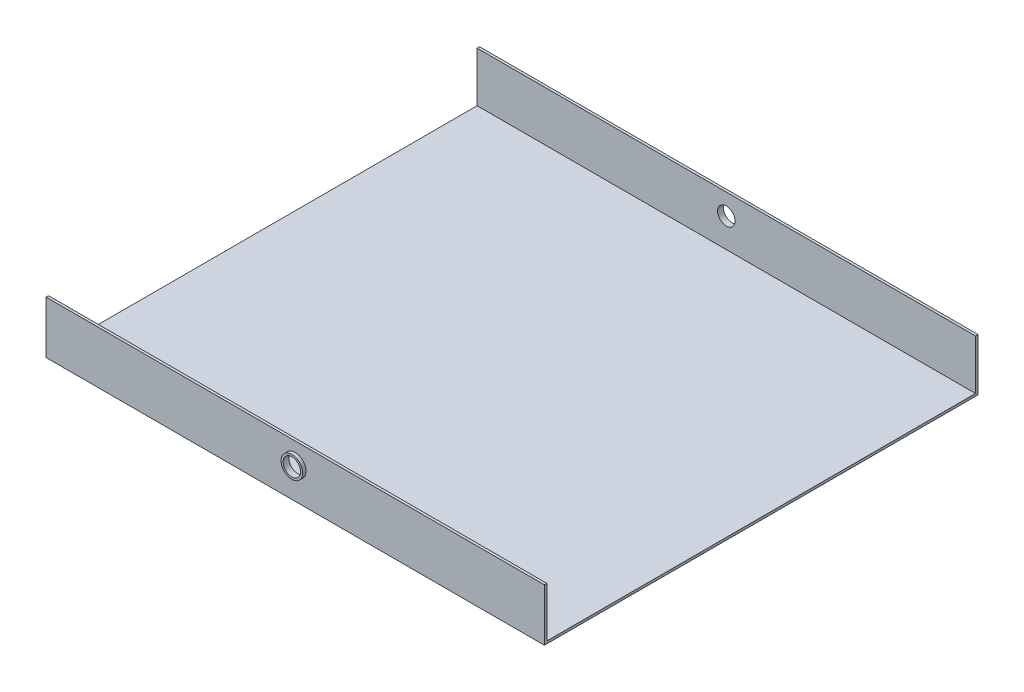
ISO-10303-21;
HEADER;
FILE_DESCRIPTION(('STEP AP214'),'2;1');
FILE_NAME('part.step','',(''),(''),'','','');
FILE_SCHEMA(('AUTOMOTIVE_DESIGN { 1 0 10303 214 1 1 1 1 }'));
ENDSEC;
DATA;
#1=APPLICATION_CONTEXT('core data for automotive mechanical design processes');
#2=APPLICATION_PROTOCOL_DEFINITION('international standard','automotive_design',2000,#1);
#3=PRODUCT_CONTEXT('',#1,'mechanical');
#4=PRODUCT('Part','Part','',(#3));
#5=PRODUCT_RELATED_PRODUCT_CATEGORY('part','',(#4));
#6=PRODUCT_DEFINITION_FORMATION('','',#4);
#7=PRODUCT_DEFINITION_CONTEXT('part definition',#1,'design');
#8=PRODUCT_DEFINITION('design','',#6,#7);
#9=PRODUCT_DEFINITION_SHAPE('','',#8);
#10=(LENGTH_UNIT() NAMED_UNIT(*) SI_UNIT(.MILLI.,.METRE.));
#11=(NAMED_UNIT(*) PLANE_ANGLE_UNIT() SI_UNIT($,.RADIAN.));
#12=(NAMED_UNIT(*) SI_UNIT($,.STERADIAN.) SOLID_ANGLE_UNIT());
#13=UNCERTAINTY_MEASURE_WITH_UNIT(LENGTH_MEASURE(1.E-05),#10,'distance_accuracy_value','');
#14=(GEOMETRIC_REPRESENTATION_CONTEXT(3) GLOBAL_UNCERTAINTY_ASSIGNED_CONTEXT((#13)) GLOBAL_UNIT_ASSIGNED_CONTEXT((#10,
#11,#12)) REPRESENTATION_CONTEXT('',''));
#15=CARTESIAN_POINT('',(0.,0.,0.));
#16=DIRECTION('',(0.,0.,1.));
#17=DIRECTION('',(1.,0.,0.));
#18=AXIS2_PLACEMENT_3D('',#15,#16,#17);
#19=CARTESIAN_POINT('',(1200.,12.6983317095866,-1044.));
#20=DIRECTION('',(0.,0.,1.));
#21=DIRECTION('',(1.,0.,0.));
#22=AXIS2_PLACEMENT_3D('',#19,#20,#21);
#23=PLANE('',#22);
#24=DIRECTION('',(0.,1.,0.));
#25=VECTOR('',#24,1.);
#26=CARTESIAN_POINT('',(-1200.,12.6983317095866,-1044.));
#27=LINE('',#26,#25);
#28=CARTESIAN_POINT('',(-1200.,0.698331709586608,-1044.));
#29=VERTEX_POINT('',#28);
#30=CARTESIAN_POINT('',(-1200.,252.698331709587,-1044.));
#31=VERTEX_POINT('',#30);
#32=EDGE_CURVE('E126',#29,#31,#27,.T.);
#33=ORIENTED_EDGE('',*,*,#32,.T.);
#34=DIRECTION('',(-1.,0.,0.));
#35=VECTOR('',#34,1.);
#36=CARTESIAN_POINT('',(1200.,252.698331709587,-1044.));
#37=LINE('',#36,#35);
#38=CARTESIAN_POINT('',(1200.,252.698331709587,-1044.));
#39=VERTEX_POINT('',#38);
#40=EDGE_CURVE('E50',#39,#31,#37,.T.);
#41=ORIENTED_EDGE('',*,*,#40,.F.);
#42=DIRECTION('',(0.,1.,0.));
#43=VECTOR('',#42,1.);
#44=CARTESIAN_POINT('',(1200.,12.6983317095866,-1044.));
#45=LINE('',#44,#43);
#46=CARTESIAN_POINT('',(1200.,0.698331709586608,-1044.));
#47=VERTEX_POINT('',#46);
#48=EDGE_CURVE('E89',#47,#39,#45,.T.);
#49=ORIENTED_EDGE('',*,*,#48,.F.);
#50=DIRECTION('',(-1.,0.,0.));
#51=VECTOR('',#50,1.);
#52=CARTESIAN_POINT('',(1200.,0.698331709586608,-1044.));
#53=LINE('',#52,#51);
#54=EDGE_CURVE('E116',#47,#29,#53,.T.);
#55=ORIENTED_EDGE('',*,*,#54,.T.);
#56=EDGE_LOOP('',(#33,#41,#49,#55));
#57=FACE_BOUND('',#56,.T.);
#58=CARTESIAN_POINT('',(-3.49077471759439E-13,152.698331709587,-1044.));
#59=DIRECTION('',(0.,0.,1.));
#60=DIRECTION('',(1.,0.,0.));
#61=AXIS2_PLACEMENT_3D('',#58,#59,#60);
#62=CIRCLE('',#61,52.0000000000002);
#63=CARTESIAN_POINT('',(51.9999999999998,152.698331709587,-1044.));
#64=VERTEX_POINT('',#63);
#65=EDGE_CURVE('E11',#64,#64,#62,.F.);
#66=ORIENTED_EDGE('',*,*,#65,.F.);
#67=EDGE_LOOP('',(#66));
#68=FACE_BOUND('',#67,.T.);
#69=ADVANCED_FACE('F42',(#57,#68),#23,.F.);
#70=CARTESIAN_POINT('',(1200.,12.6983317095866,1044.));
#71=DIRECTION('',(0.,0.,1.));
#72=DIRECTION('',(1.,0.,0.));
#73=AXIS2_PLACEMENT_3D('',#70,#71,#72);
#74=PLANE('',#73);
#75=DIRECTION('',(0.,1.,0.));
#76=VECTOR('',#75,1.);
#77=CARTESIAN_POINT('',(-1200.,12.6983317095866,1044.));
#78=LINE('',#77,#76);
#79=CARTESIAN_POINT('',(-1200.,0.698331709586608,1044.));
#80=VERTEX_POINT('',#79);
#81=CARTESIAN_POINT('',(-1200.,252.698331709587,1044.));
#82=VERTEX_POINT('',#81);
#83=EDGE_CURVE('E125',#80,#82,#78,.T.);
#84=ORIENTED_EDGE('',*,*,#83,.F.);
#85=DIRECTION('',(-1.,0.,0.));
#86=VECTOR('',#85,1.);
#87=CARTESIAN_POINT('',(1200.,0.698331709586608,1044.));
#88=LINE('',#87,#86);
#89=CARTESIAN_POINT('',(1200.,0.698331709586608,1044.));
#90=VERTEX_POINT('',#89);
#91=EDGE_CURVE('E114',#90,#80,#88,.T.);
#92=ORIENTED_EDGE('',*,*,#91,.F.);
#93=DIRECTION('',(0.,1.,0.));
#94=VECTOR('',#93,1.);
#95=CARTESIAN_POINT('',(1200.,12.6983317095866,1044.));
#96=LINE('',#95,#94);
#97=CARTESIAN_POINT('',(1200.,252.698331709587,1044.));
#98=VERTEX_POINT('',#97);
#99=EDGE_CURVE('E123',#90,#98,#96,.T.);
#100=ORIENTED_EDGE('',*,*,#99,.T.);
#101=DIRECTION('',(-1.,0.,0.));
#102=VECTOR('',#101,1.);
#103=CARTESIAN_POINT('',(1200.,252.698331709587,1044.));
#104=LINE('',#103,#102);
#105=EDGE_CURVE('E145',#98,#82,#104,.T.);
#106=ORIENTED_EDGE('',*,*,#105,.T.);
#107=EDGE_LOOP('',(#84,#92,#100,#106));
#108=FACE_BOUND('',#107,.T.);
#109=CARTESIAN_POINT('',(-3.49077471759439E-13,152.698331709587,1044.));
#110=DIRECTION('',(0.,0.,1.));
#111=DIRECTION('',(1.,0.,0.));
#112=AXIS2_PLACEMENT_3D('',#109,#110,#111);
#113=CIRCLE('',#112,52.0000000000001);
#114=CARTESIAN_POINT('',(51.9999999999998,152.698331709587,1044.));
#115=VERTEX_POINT('',#114);
#116=EDGE_CURVE('E184',#115,#115,#113,.T.);
#117=ORIENTED_EDGE('',*,*,#116,.F.);
#118=EDGE_LOOP('',(#117));
#119=FACE_BOUND('',#118,.T.);
#120=ADVANCED_FACE('F121',(#108,#119),#74,.T.);
#121=CARTESIAN_POINT('',(1200.,252.698331709587,-1032.));
#122=DIRECTION('',(0.,1.,0.));
#123=DIRECTION('',(0.,0.,1.));
#124=AXIS2_PLACEMENT_3D('',#121,#122,#123);
#125=PLANE('',#124);
#126=DIRECTION('',(0.,0.,-1.));
#127=VECTOR('',#126,1.);
#128=CARTESIAN_POINT('',(-1200.,252.698331709587,-1032.));
#129=LINE('',#128,#127);
#130=CARTESIAN_POINT('',(-1200.,252.698331709587,-1032.));
#131=VERTEX_POINT('',#130);
#132=EDGE_CURVE('E165',#131,#31,#129,.T.);
#133=ORIENTED_EDGE('',*,*,#132,.F.);
#134=DIRECTION('',(-1.,0.,0.));
#135=VECTOR('',#134,1.);
#136=CARTESIAN_POINT('',(1200.,252.698331709587,-1032.));
#137=LINE('',#136,#135);
#138=CARTESIAN_POINT('',(1200.,252.698331709587,-1032.));
#139=VERTEX_POINT('',#138);
#140=EDGE_CURVE('E175',#139,#131,#137,.T.);
#141=ORIENTED_EDGE('',*,*,#140,.F.);
#142=DIRECTION('',(0.,0.,-1.));
#143=VECTOR('',#142,1.);
#144=CARTESIAN_POINT('',(1200.,252.698331709587,-1032.));
#145=LINE('',#144,#143);
#146=EDGE_CURVE('E155',#139,#39,#145,.T.);
#147=ORIENTED_EDGE('',*,*,#146,.T.);
#148=ORIENTED_EDGE('',*,*,#40,.T.);
#149=EDGE_LOOP('',(#133,#141,#147,#148));
#150=FACE_BOUND('',#149,.T.);
#151=ADVANCED_FACE('F222',(#150),#125,.T.);
#152=CARTESIAN_POINT('',(1200.,12.6983317095866,-1032.));
#153=DIRECTION('',(0.,0.,1.));
#154=DIRECTION('',(1.,0.,0.));
#155=AXIS2_PLACEMENT_3D('',#152,#153,#154);
#156=PLANE('',#155);
#157=CARTESIAN_POINT('',(-3.49077471759439E-13,152.698331709587,-1032.));
#158=DIRECTION('',(0.,0.,1.));
#159=DIRECTION('',(1.,0.,0.));
#160=AXIS2_PLACEMENT_3D('',#157,#158,#159);
#161=CIRCLE('',#160,42.);
#162=CARTESIAN_POINT('',(41.9999999999997,152.698331709587,-1032.));
#163=VERTEX_POINT('',#162);
#164=EDGE_CURVE('E141',#163,#163,#161,.T.);
#165=ORIENTED_EDGE('',*,*,#164,.F.);
#166=EDGE_LOOP('',(#165));
#167=FACE_BOUND('',#166,.T.);
#168=DIRECTION('',(0.,1.,0.));
#169=VECTOR('',#168,1.);
#170=CARTESIAN_POINT('',(-1200.,12.6983317095866,-1032.));
#171=LINE('',#170,#169);
#172=CARTESIAN_POINT('',(-1200.,12.6983317095866,-1032.));
#173=VERTEX_POINT('',#172);
#174=EDGE_CURVE('E168',#173,#131,#171,.T.);
#175=ORIENTED_EDGE('',*,*,#174,.F.);
#176=DIRECTION('',(-1.,0.,0.));
#177=VECTOR('',#176,1.);
#178=CARTESIAN_POINT('',(1200.,12.6983317095866,-1032.));
#179=LINE('',#178,#177);
#180=CARTESIAN_POINT('',(1200.,12.6983317095866,-1032.));
#181=VERTEX_POINT('',#180);
#182=EDGE_CURVE('E173',#181,#173,#179,.T.);
#183=ORIENTED_EDGE('',*,*,#182,.F.);
#184=DIRECTION('',(0.,1.,0.));
#185=VECTOR('',#184,1.);
#186=CARTESIAN_POINT('',(1200.,12.6983317095866,-1032.));
#187=LINE('',#186,#185);
#188=EDGE_CURVE('E158',#181,#139,#187,.T.);
#189=ORIENTED_EDGE('',*,*,#188,.T.);
#190=ORIENTED_EDGE('',*,*,#140,.T.);
#191=EDGE_LOOP('',(#175,#183,#189,#190));
#192=FACE_BOUND('',#191,.T.);
#193=ADVANCED_FACE('F234',(#167,#192),#156,.T.);
#194=CARTESIAN_POINT('',(1200.,12.6983317095866,-800.000000000001));
#195=DIRECTION('',(0.,1.,0.));
#196=DIRECTION('',(0.,0.,1.));
#197=AXIS2_PLACEMENT_3D('',#194,#195,#196);
#198=PLANE('',#197);
#199=DIRECTION('',(0.,0.,-1.));
#200=VECTOR('',#199,1.);
#201=CARTESIAN_POINT('',(-1200.,12.6983317095866,-800.000000000001));
#202=LINE('',#201,#200);
#203=CARTESIAN_POINT('',(-1200.,12.6983317095866,1032.));
#204=VERTEX_POINT('',#203);
#205=EDGE_CURVE('E77',#204,#173,#202,.T.);
#206=ORIENTED_EDGE('',*,*,#205,.F.);
#207=DIRECTION('',(-1.,0.,0.));
#208=VECTOR('',#207,1.);
#209=CARTESIAN_POINT('',(1200.,12.6983317095866,1032.));
#210=LINE('',#209,#208);
#211=CARTESIAN_POINT('',(1200.,12.6983317095866,1032.));
#212=VERTEX_POINT('',#211);
#213=EDGE_CURVE('E127',#212,#204,#210,.T.);
#214=ORIENTED_EDGE('',*,*,#213,.F.);
#215=DIRECTION('',(0.,0.,-1.));
#216=VECTOR('',#215,1.);
#217=CARTESIAN_POINT('',(1200.,12.6983317095866,-800.000000000001));
#218=LINE('',#217,#216);
#219=EDGE_CURVE('E117',#212,#181,#218,.T.);
#220=ORIENTED_EDGE('',*,*,#219,.T.);
#221=ORIENTED_EDGE('',*,*,#182,.T.);
#222=EDGE_LOOP('',(#206,#214,#220,#221));
#223=FACE_BOUND('',#222,.T.);
#224=ADVANCED_FACE('F236',(#223),#198,.T.);
#225=CARTESIAN_POINT('',(1200.,0.698331709586608,-800.000000000001));
#226=DIRECTION('',(0.,1.,0.));
#227=DIRECTION('',(0.,0.,1.));
#228=AXIS2_PLACEMENT_3D('',#225,#226,#227);
#229=PLANE('',#228);
#230=DIRECTION('',(0.,0.,-1.));
#231=VECTOR('',#230,1.);
#232=CARTESIAN_POINT('',(-1200.,0.698331709586608,-800.000000000001));
#233=LINE('',#232,#231);
#234=EDGE_CURVE('E84',#80,#29,#233,.T.);
#235=ORIENTED_EDGE('',*,*,#234,.T.);
#236=ORIENTED_EDGE('',*,*,#54,.F.);
#237=DIRECTION('',(0.,0.,-1.));
#238=VECTOR('',#237,1.);
#239=CARTESIAN_POINT('',(1200.,0.698331709586608,-800.000000000001));
#240=LINE('',#239,#238);
#241=EDGE_CURVE('E58',#90,#47,#240,.T.);
#242=ORIENTED_EDGE('',*,*,#241,.F.);
#243=ORIENTED_EDGE('',*,*,#91,.T.);
#244=EDGE_LOOP('',(#235,#236,#242,#243));
#245=FACE_BOUND('',#244,.T.);
#246=ADVANCED_FACE('F113',(#245),#229,.F.);
#247=CARTESIAN_POINT('',(1200.,-211.301668290413,-1.06007604958585E-12));
#248=DIRECTION('',(-1.,0.,0.));
#249=DIRECTION('',(0.,0.,1.));
#250=AXIS2_PLACEMENT_3D('',#247,#248,#249);
#251=PLANE('',#250);
#252=ORIENTED_EDGE('',*,*,#48,.T.);
#253=ORIENTED_EDGE('',*,*,#146,.F.);
#254=ORIENTED_EDGE('',*,*,#188,.F.);
#255=ORIENTED_EDGE('',*,*,#219,.F.);
#256=DIRECTION('',(0.,1.,0.));
#257=VECTOR('',#256,1.);
#258=CARTESIAN_POINT('',(1200.,12.6983317095866,1032.));
#259=LINE('',#258,#257);
#260=CARTESIAN_POINT('',(1200.,252.698331709587,1032.));
#261=VERTEX_POINT('',#260);
#262=EDGE_CURVE('E133',#212,#261,#259,.T.);
#263=ORIENTED_EDGE('',*,*,#262,.T.);
#264=DIRECTION('',(0.,0.,1.));
#265=VECTOR('',#264,1.);
#266=CARTESIAN_POINT('',(1200.,252.698331709587,1032.));
#267=LINE('',#266,#265);
#268=EDGE_CURVE('E131',#261,#98,#267,.T.);
#269=ORIENTED_EDGE('',*,*,#268,.T.);
#270=ORIENTED_EDGE('',*,*,#99,.F.);
#271=ORIENTED_EDGE('',*,*,#241,.T.);
#272=EDGE_LOOP('',(#252,#253,#254,#255,#263,#269,#270,#271));
#273=FACE_BOUND('',#272,.T.);
#274=ADVANCED_FACE('F129',(#273),#251,.F.);
#275=CARTESIAN_POINT('',(-1200.,-211.301668290413,-1.06007604958585E-12));
#276=DIRECTION('',(-1.,0.,0.));
#277=DIRECTION('',(0.,0.,1.));
#278=AXIS2_PLACEMENT_3D('',#275,#276,#277);
#279=PLANE('',#278);
#280=ORIENTED_EDGE('',*,*,#32,.F.);
#281=ORIENTED_EDGE('',*,*,#234,.F.);
#282=ORIENTED_EDGE('',*,*,#83,.T.);
#283=DIRECTION('',(0.,0.,1.));
#284=VECTOR('',#283,1.);
#285=CARTESIAN_POINT('',(-1200.,252.698331709587,1032.));
#286=LINE('',#285,#284);
#287=CARTESIAN_POINT('',(-1200.,252.698331709587,1032.));
#288=VERTEX_POINT('',#287);
#289=EDGE_CURVE('E134',#288,#82,#286,.T.);
#290=ORIENTED_EDGE('',*,*,#289,.F.);
#291=DIRECTION('',(0.,1.,0.));
#292=VECTOR('',#291,1.);
#293=CARTESIAN_POINT('',(-1200.,12.6983317095866,1032.));
#294=LINE('',#293,#292);
#295=EDGE_CURVE('E138',#204,#288,#294,.T.);
#296=ORIENTED_EDGE('',*,*,#295,.F.);
#297=ORIENTED_EDGE('',*,*,#205,.T.);
#298=ORIENTED_EDGE('',*,*,#174,.T.);
#299=ORIENTED_EDGE('',*,*,#132,.T.);
#300=EDGE_LOOP('',(#280,#281,#282,#290,#296,#297,#298,#299));
#301=FACE_BOUND('',#300,.T.);
#302=ADVANCED_FACE('F229',(#301),#279,.T.);
#303=CARTESIAN_POINT('',(1200.,12.6983317095866,1032.));
#304=DIRECTION('',(0.,0.,1.));
#305=DIRECTION('',(1.,0.,0.));
#306=AXIS2_PLACEMENT_3D('',#303,#304,#305);
#307=PLANE('',#306);
#308=CARTESIAN_POINT('',(-3.49077471759439E-13,152.698331709587,1032.));
#309=DIRECTION('',(0.,0.,1.));
#310=DIRECTION('',(1.,0.,0.));
#311=AXIS2_PLACEMENT_3D('',#308,#309,#310);
#312=CIRCLE('',#311,42.);
#313=CARTESIAN_POINT('',(41.9999999999997,152.698331709587,1032.));
#314=VERTEX_POINT('',#313);
#315=EDGE_CURVE('E177',#314,#314,#312,.T.);
#316=ORIENTED_EDGE('',*,*,#315,.T.);
#317=EDGE_LOOP('',(#316));
#318=FACE_BOUND('',#317,.T.);
#319=ORIENTED_EDGE('',*,*,#295,.T.);
#320=DIRECTION('',(-1.,0.,0.));
#321=VECTOR('',#320,1.);
#322=CARTESIAN_POINT('',(1200.,252.698331709587,1032.));
#323=LINE('',#322,#321);
#324=EDGE_CURVE('E149',#261,#288,#323,.T.);
#325=ORIENTED_EDGE('',*,*,#324,.F.);
#326=ORIENTED_EDGE('',*,*,#262,.F.);
#327=ORIENTED_EDGE('',*,*,#213,.T.);
#328=EDGE_LOOP('',(#319,#325,#326,#327));
#329=FACE_BOUND('',#328,.T.);
#330=ADVANCED_FACE('F241',(#318,#329),#307,.F.);
#331=CARTESIAN_POINT('',(1200.,252.698331709587,1032.));
#332=DIRECTION('',(0.,-1.,0.));
#333=DIRECTION('',(0.,0.,-1.));
#334=AXIS2_PLACEMENT_3D('',#331,#332,#333);
#335=PLANE('',#334);
#336=ORIENTED_EDGE('',*,*,#289,.T.);
#337=ORIENTED_EDGE('',*,*,#105,.F.);
#338=ORIENTED_EDGE('',*,*,#268,.F.);
#339=ORIENTED_EDGE('',*,*,#324,.T.);
#340=EDGE_LOOP('',(#336,#337,#338,#339));
#341=FACE_BOUND('',#340,.T.);
#342=ADVANCED_FACE('F244',(#341),#335,.F.);
#343=CARTESIAN_POINT('',(-3.49077471759439E-13,152.698331709587,1044.));
#344=DIRECTION('',(0.,0.,-1.));
#345=DIRECTION('',(-1.,0.,0.));
#346=AXIS2_PLACEMENT_3D('',#343,#344,#345);
#347=CYLINDRICAL_SURFACE('',#346,42.);
#348=ORIENTED_EDGE('',*,*,#315,.F.);
#349=EDGE_LOOP('',(#348));
#350=FACE_BOUND('',#349,.T.);
#351=CARTESIAN_POINT('',(-3.49077471759439E-13,152.698331709587,1060.));
#352=DIRECTION('',(0.,0.,1.));
#353=DIRECTION('',(1.,0.,0.));
#354=AXIS2_PLACEMENT_3D('',#351,#352,#353);
#355=CIRCLE('',#354,42.);
#356=CARTESIAN_POINT('',(41.9999999999997,152.698331709587,1060.));
#357=VERTEX_POINT('',#356);
#358=EDGE_CURVE('E189',#357,#357,#355,.T.);
#359=ORIENTED_EDGE('',*,*,#358,.T.);
#360=EDGE_LOOP('',(#359));
#361=FACE_BOUND('',#360,.T.);
#362=ADVANCED_FACE('F246',(#350,#361),#347,.F.);
#363=ORIENTED_EDGE('',*,*,#164,.T.);
#364=EDGE_LOOP('',(#363));
#365=FACE_BOUND('',#364,.T.);
#366=CARTESIAN_POINT('',(-3.49077471759439E-13,152.698331709587,-1060.));
#367=DIRECTION('',(0.,0.,-1.));
#368=DIRECTION('',(-1.,0.,0.));
#369=AXIS2_PLACEMENT_3D('',#366,#367,#368);
#370=CIRCLE('',#369,42.);
#371=CARTESIAN_POINT('',(-42.0000000000004,152.698331709587,-1060.));
#372=VERTEX_POINT('',#371);
#373=EDGE_CURVE('E196',#372,#372,#370,.T.);
#374=ORIENTED_EDGE('',*,*,#373,.T.);
#375=EDGE_LOOP('',(#374));
#376=FACE_BOUND('',#375,.T.);
#377=ADVANCED_FACE('F200',(#365,#376),#347,.F.);
#378=CARTESIAN_POINT('',(-3.49077471759439E-13,152.698331709587,1060.));
#379=DIRECTION('',(0.,0.,1.));
#380=DIRECTION('',(1.,0.,0.));
#381=AXIS2_PLACEMENT_3D('',#378,#379,#380);
#382=PLANE('',#381);
#383=CARTESIAN_POINT('',(-3.49077471759439E-13,152.698331709587,1060.));
#384=DIRECTION('',(0.,0.,1.));
#385=DIRECTION('',(1.,0.,0.));
#386=AXIS2_PLACEMENT_3D('',#383,#384,#385);
#387=CIRCLE('',#386,52.0000000000001);
#388=CARTESIAN_POINT('',(51.9999999999998,152.698331709587,1060.));
#389=VERTEX_POINT('',#388);
#390=EDGE_CURVE('E179',#389,#389,#387,.T.);
#391=ORIENTED_EDGE('',*,*,#390,.T.);
#392=EDGE_LOOP('',(#391));
#393=FACE_BOUND('',#392,.T.);
#394=ORIENTED_EDGE('',*,*,#358,.F.);
#395=EDGE_LOOP('',(#394));
#396=FACE_BOUND('',#395,.T.);
#397=ADVANCED_FACE('F214',(#393,#396),#382,.T.);
#398=CARTESIAN_POINT('',(-3.49077471759439E-13,152.698331709587,1060.));
#399=DIRECTION('',(0.,0.,-1.));
#400=DIRECTION('',(-1.,0.,0.));
#401=AXIS2_PLACEMENT_3D('',#398,#399,#400);
#402=CYLINDRICAL_SURFACE('',#401,52.0000000000001);
#403=ORIENTED_EDGE('',*,*,#390,.F.);
#404=EDGE_LOOP('',(#403));
#405=FACE_BOUND('',#404,.T.);
#406=ORIENTED_EDGE('',*,*,#116,.T.);
#407=EDGE_LOOP('',(#406));
#408=FACE_BOUND('',#407,.T.);
#409=ADVANCED_FACE('F205',(#405,#408),#402,.T.);
#410=CARTESIAN_POINT('',(-3.49077471759439E-13,152.698331709587,-1060.));
#411=DIRECTION('',(0.,0.,-1.));
#412=DIRECTION('',(-1.,0.,0.));
#413=AXIS2_PLACEMENT_3D('',#410,#411,#412);
#414=PLANE('',#413);
#415=CARTESIAN_POINT('',(-3.49077471759439E-13,152.698331709587,-1060.));
#416=DIRECTION('',(0.,0.,-1.));
#417=DIRECTION('',(-1.,0.,0.));
#418=AXIS2_PLACEMENT_3D('',#415,#416,#417);
#419=CIRCLE('',#418,52.0000000000002);
#420=CARTESIAN_POINT('',(-52.0000000000005,152.698331709587,-1060.));
#421=VERTEX_POINT('',#420);
#422=EDGE_CURVE('E193',#421,#421,#419,.T.);
#423=ORIENTED_EDGE('',*,*,#422,.T.);
#424=EDGE_LOOP('',(#423));
#425=FACE_BOUND('',#424,.T.);
#426=ORIENTED_EDGE('',*,*,#373,.F.);
#427=EDGE_LOOP('',(#426));
#428=FACE_BOUND('',#427,.T.);
#429=ADVANCED_FACE('F202',(#425,#428),#414,.T.);
#430=CARTESIAN_POINT('',(-3.49077471759439E-13,152.698331709587,-1060.));
#431=DIRECTION('',(0.,0.,1.));
#432=DIRECTION('',(1.,0.,0.));
#433=AXIS2_PLACEMENT_3D('',#430,#431,#432);
#434=CYLINDRICAL_SURFACE('',#433,52.0000000000002);
#435=ORIENTED_EDGE('',*,*,#422,.F.);
#436=EDGE_LOOP('',(#435));
#437=FACE_BOUND('',#436,.T.);
#438=ORIENTED_EDGE('',*,*,#65,.T.);
#439=EDGE_LOOP('',(#438));
#440=FACE_BOUND('',#439,.T.);
#441=ADVANCED_FACE('F204',(#437,#440),#434,.T.);
#442=CLOSED_SHELL('',(#69,#120,#151,#193,#224,#246,#274,#302,#330,#342,#362,#377,#397,#409,#429,#441));
#443=MANIFOLD_SOLID_BREP('B2',#442);
#444=ADVANCED_BREP_SHAPE_REPRESENTATION('',(#18,#443),#14);
#445=SHAPE_DEFINITION_REPRESENTATION(#9,#444);
ENDSEC;
END-ISO-10303-21;
